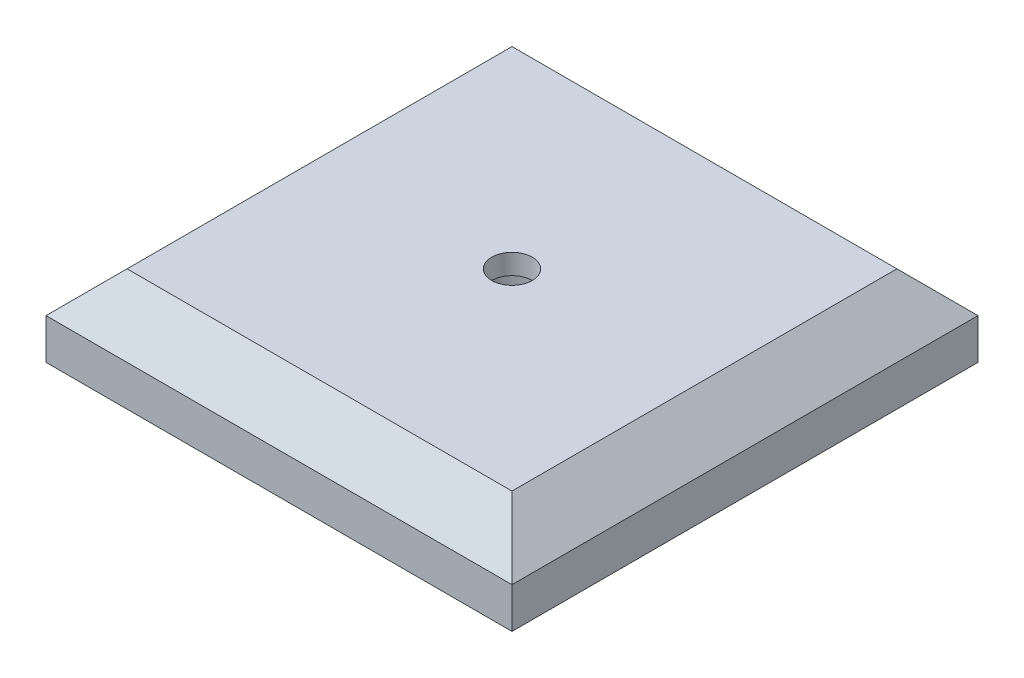
ISO-10303-21;
HEADER;
FILE_DESCRIPTION(('STEP AP214'),'2;1');
FILE_NAME('part.step','',(''),(''),'','','');
FILE_SCHEMA(('AUTOMOTIVE_DESIGN { 1 0 10303 214 1 1 1 1 }'));
ENDSEC;
DATA;
#1=APPLICATION_CONTEXT('core data for automotive mechanical design processes');
#2=APPLICATION_PROTOCOL_DEFINITION('international standard','automotive_design',2000,#1);
#3=PRODUCT_CONTEXT('',#1,'mechanical');
#4=PRODUCT('Part','Part','',(#3));
#5=PRODUCT_RELATED_PRODUCT_CATEGORY('part','',(#4));
#6=PRODUCT_DEFINITION_FORMATION('','',#4);
#7=PRODUCT_DEFINITION_CONTEXT('part definition',#1,'design');
#8=PRODUCT_DEFINITION('design','',#6,#7);
#9=PRODUCT_DEFINITION_SHAPE('','',#8);
#10=(LENGTH_UNIT() NAMED_UNIT(*) SI_UNIT(.MILLI.,.METRE.));
#11=(NAMED_UNIT(*) PLANE_ANGLE_UNIT() SI_UNIT($,.RADIAN.));
#12=(NAMED_UNIT(*) SI_UNIT($,.STERADIAN.) SOLID_ANGLE_UNIT());
#13=UNCERTAINTY_MEASURE_WITH_UNIT(LENGTH_MEASURE(1.E-05),#10,'distance_accuracy_value','');
#14=(GEOMETRIC_REPRESENTATION_CONTEXT(3) GLOBAL_UNCERTAINTY_ASSIGNED_CONTEXT((#13)) GLOBAL_UNIT_ASSIGNED_CONTEXT((#10,
#11,#12)) REPRESENTATION_CONTEXT('',''));
#15=CARTESIAN_POINT('',(0.,0.,0.));
#16=DIRECTION('',(0.,0.,1.));
#17=DIRECTION('',(1.,0.,0.));
#18=AXIS2_PLACEMENT_3D('',#15,#16,#17);
#19=CARTESIAN_POINT('',(1.4375,0.5,1.4375));
#20=DIRECTION('',(-1.,0.,0.));
#21=DIRECTION('',(0.,0.,1.));
#22=AXIS2_PLACEMENT_3D('',#19,#20,#21);
#23=PLANE('',#22);
#24=DIRECTION('',(0.,-1.,0.));
#25=VECTOR('',#24,1.);
#26=CARTESIAN_POINT('',(1.4375,0.5,-1.4375));
#27=LINE('',#26,#25);
#28=CARTESIAN_POINT('',(1.4375,0.25,-1.4375));
#29=VERTEX_POINT('',#28);
#30=CARTESIAN_POINT('',(1.4375,0.,-1.4375));
#31=VERTEX_POINT('',#30);
#32=EDGE_CURVE('E94',#29,#31,#27,.T.);
#33=ORIENTED_EDGE('',*,*,#32,.F.);
#34=DIRECTION('',(0.,0.,1.));
#35=VECTOR('',#34,1.);
#36=CARTESIAN_POINT('',(1.4375,0.25,1.4375));
#37=LINE('',#36,#35);
#38=CARTESIAN_POINT('',(1.4375,0.25,1.4375));
#39=VERTEX_POINT('',#38);
#40=EDGE_CURVE('E52',#29,#39,#37,.T.);
#41=ORIENTED_EDGE('',*,*,#40,.T.);
#42=DIRECTION('',(0.,-1.,0.));
#43=VECTOR('',#42,1.);
#44=CARTESIAN_POINT('',(1.4375,0.5,1.4375));
#45=LINE('',#44,#43);
#46=CARTESIAN_POINT('',(1.4375,0.,1.4375));
#47=VERTEX_POINT('',#46);
#48=EDGE_CURVE('E113',#39,#47,#45,.T.);
#49=ORIENTED_EDGE('',*,*,#48,.T.);
#50=DIRECTION('',(0.,0.,-1.));
#51=VECTOR('',#50,1.);
#52=CARTESIAN_POINT('',(1.4375,0.,1.4375));
#53=LINE('',#52,#51);
#54=EDGE_CURVE('E108',#47,#31,#53,.T.);
#55=ORIENTED_EDGE('',*,*,#54,.T.);
#56=EDGE_LOOP('',(#33,#41,#49,#55));
#57=FACE_BOUND('',#56,.T.);
#58=ADVANCED_FACE('F41',(#57),#23,.F.);
#59=CARTESIAN_POINT('',(-1.4375,0.5,-1.4375));
#60=DIRECTION('',(0.,0.,1.));
#61=DIRECTION('',(1.,0.,0.));
#62=AXIS2_PLACEMENT_3D('',#59,#60,#61);
#63=PLANE('',#62);
#64=DIRECTION('',(0.,-1.,0.));
#65=VECTOR('',#64,1.);
#66=CARTESIAN_POINT('',(-1.4375,0.5,-1.4375));
#67=LINE('',#66,#65);
#68=CARTESIAN_POINT('',(-1.4375,0.25,-1.4375));
#69=VERTEX_POINT('',#68);
#70=CARTESIAN_POINT('',(-1.4375,0.,-1.4375));
#71=VERTEX_POINT('',#70);
#72=EDGE_CURVE('E102',#69,#71,#67,.T.);
#73=ORIENTED_EDGE('',*,*,#72,.F.);
#74=DIRECTION('',(1.,0.,0.));
#75=VECTOR('',#74,1.);
#76=CARTESIAN_POINT('',(-1.4375,0.25,-1.4375));
#77=LINE('',#76,#75);
#78=EDGE_CURVE('E11',#69,#29,#77,.T.);
#79=ORIENTED_EDGE('',*,*,#78,.T.);
#80=ORIENTED_EDGE('',*,*,#32,.T.);
#81=DIRECTION('',(-1.,0.,0.));
#82=VECTOR('',#81,1.);
#83=CARTESIAN_POINT('',(-1.4375,0.,-1.4375));
#84=LINE('',#83,#82);
#85=EDGE_CURVE('E97',#31,#71,#84,.T.);
#86=ORIENTED_EDGE('',*,*,#85,.T.);
#87=EDGE_LOOP('',(#73,#79,#80,#86));
#88=FACE_BOUND('',#87,.T.);
#89=ADVANCED_FACE('F96',(#88),#63,.F.);
#90=CARTESIAN_POINT('',(-1.4375,0.5,1.4375));
#91=DIRECTION('',(1.,0.,0.));
#92=DIRECTION('',(0.,0.,-1.));
#93=AXIS2_PLACEMENT_3D('',#90,#91,#92);
#94=PLANE('',#93);
#95=DIRECTION('',(0.,-1.,0.));
#96=VECTOR('',#95,1.);
#97=CARTESIAN_POINT('',(-1.4375,0.5,1.4375));
#98=LINE('',#97,#96);
#99=CARTESIAN_POINT('',(-1.4375,0.25,1.4375));
#100=VERTEX_POINT('',#99);
#101=CARTESIAN_POINT('',(-1.4375,0.,1.4375));
#102=VERTEX_POINT('',#101);
#103=EDGE_CURVE('E131',#100,#102,#98,.T.);
#104=ORIENTED_EDGE('',*,*,#103,.F.);
#105=DIRECTION('',(0.,0.,-1.));
#106=VECTOR('',#105,1.);
#107=CARTESIAN_POINT('',(-1.4375,0.25,1.4375));
#108=LINE('',#107,#106);
#109=EDGE_CURVE('E148',#100,#69,#108,.T.);
#110=ORIENTED_EDGE('',*,*,#109,.T.);
#111=ORIENTED_EDGE('',*,*,#72,.T.);
#112=DIRECTION('',(0.,0.,1.));
#113=VECTOR('',#112,1.);
#114=CARTESIAN_POINT('',(-1.4375,0.,1.4375));
#115=LINE('',#114,#113);
#116=EDGE_CURVE('E110',#71,#102,#115,.T.);
#117=ORIENTED_EDGE('',*,*,#116,.T.);
#118=EDGE_LOOP('',(#104,#110,#111,#117));
#119=FACE_BOUND('',#118,.T.);
#120=ADVANCED_FACE('F207',(#119),#94,.F.);
#121=CARTESIAN_POINT('',(-1.4375,0.5,1.4375));
#122=DIRECTION('',(0.,0.,-1.));
#123=DIRECTION('',(-1.,0.,0.));
#124=AXIS2_PLACEMENT_3D('',#121,#122,#123);
#125=PLANE('',#124);
#126=ORIENTED_EDGE('',*,*,#48,.F.);
#127=DIRECTION('',(-1.,0.,0.));
#128=VECTOR('',#127,1.);
#129=CARTESIAN_POINT('',(-1.4375,0.25,1.4375));
#130=LINE('',#129,#128);
#131=EDGE_CURVE('E152',#39,#100,#130,.T.);
#132=ORIENTED_EDGE('',*,*,#131,.T.);
#133=ORIENTED_EDGE('',*,*,#103,.T.);
#134=DIRECTION('',(1.,0.,0.));
#135=VECTOR('',#134,1.);
#136=CARTESIAN_POINT('',(-1.4375,0.,1.4375));
#137=LINE('',#136,#135);
#138=EDGE_CURVE('E126',#102,#47,#137,.T.);
#139=ORIENTED_EDGE('',*,*,#138,.T.);
#140=EDGE_LOOP('',(#126,#132,#133,#139));
#141=FACE_BOUND('',#140,.T.);
#142=ADVANCED_FACE('F198',(#141),#125,.F.);
#143=CARTESIAN_POINT('',(0.,0.5,0.));
#144=DIRECTION('',(0.,-1.,0.));
#145=DIRECTION('',(0.,0.,-1.));
#146=AXIS2_PLACEMENT_3D('',#143,#144,#145);
#147=PLANE('',#146);
#148=DIRECTION('',(-1.,0.,0.));
#149=VECTOR('',#148,1.);
#150=CARTESIAN_POINT('',(0.,0.5,-1.1875));
#151=LINE('',#150,#149);
#152=CARTESIAN_POINT('',(1.1875,0.5,-1.1875));
#153=VERTEX_POINT('',#152);
#154=CARTESIAN_POINT('',(-1.1875,0.5,-1.1875));
#155=VERTEX_POINT('',#154);
#156=EDGE_CURVE('E101',#153,#155,#151,.T.);
#157=ORIENTED_EDGE('',*,*,#156,.T.);
#158=DIRECTION('',(0.,0.,1.));
#159=VECTOR('',#158,1.);
#160=CARTESIAN_POINT('',(-1.1875,0.5,0.));
#161=LINE('',#160,#159);
#162=CARTESIAN_POINT('',(-1.1875,0.5,1.1875));
#163=VERTEX_POINT('',#162);
#164=EDGE_CURVE('E144',#155,#163,#161,.T.);
#165=ORIENTED_EDGE('',*,*,#164,.T.);
#166=DIRECTION('',(1.,0.,0.));
#167=VECTOR('',#166,1.);
#168=CARTESIAN_POINT('',(0.,0.5,1.1875));
#169=LINE('',#168,#167);
#170=CARTESIAN_POINT('',(1.1875,0.5,1.1875));
#171=VERTEX_POINT('',#170);
#172=EDGE_CURVE('E141',#163,#171,#169,.T.);
#173=ORIENTED_EDGE('',*,*,#172,.T.);
#174=DIRECTION('',(0.,0.,-1.));
#175=VECTOR('',#174,1.);
#176=CARTESIAN_POINT('',(1.1875,0.5,0.));
#177=LINE('',#176,#175);
#178=EDGE_CURVE('E138',#171,#153,#177,.T.);
#179=ORIENTED_EDGE('',*,*,#178,.T.);
#180=EDGE_LOOP('',(#157,#165,#173,#179));
#181=FACE_BOUND('',#180,.T.);
#182=CARTESIAN_POINT('',(0.,0.5,0.));
#183=DIRECTION('',(0.,1.,0.));
#184=DIRECTION('',(0.,0.,1.));
#185=AXIS2_PLACEMENT_3D('',#182,#183,#184);
#186=CIRCLE('',#185,0.125);
#187=CARTESIAN_POINT('',(0.,0.5,0.125));
#188=VERTEX_POINT('',#187);
#189=EDGE_CURVE('E116',#188,#188,#186,.T.);
#190=ORIENTED_EDGE('',*,*,#189,.F.);
#191=EDGE_LOOP('',(#190));
#192=FACE_BOUND('',#191,.T.);
#193=ADVANCED_FACE('F196',(#181,#192),#147,.F.);
#194=CARTESIAN_POINT('',(0.,0.,0.));
#195=DIRECTION('',(0.,-1.,0.));
#196=DIRECTION('',(0.,0.,-1.));
#197=AXIS2_PLACEMENT_3D('',#194,#195,#196);
#198=PLANE('',#197);
#199=CARTESIAN_POINT('',(0.,0.,0.));
#200=DIRECTION('',(0.,-1.,0.));
#201=DIRECTION('',(0.,0.,-1.));
#202=AXIS2_PLACEMENT_3D('',#199,#200,#201);
#203=CIRCLE('',#202,0.25);
#204=CARTESIAN_POINT('',(0.,0.,-0.25));
#205=VERTEX_POINT('',#204);
#206=EDGE_CURVE('E171',#205,#205,#203,.T.);
#207=ORIENTED_EDGE('',*,*,#206,.F.);
#208=EDGE_LOOP('',(#207));
#209=FACE_BOUND('',#208,.T.);
#210=ORIENTED_EDGE('',*,*,#54,.F.);
#211=ORIENTED_EDGE('',*,*,#138,.F.);
#212=ORIENTED_EDGE('',*,*,#116,.F.);
#213=ORIENTED_EDGE('',*,*,#85,.F.);
#214=EDGE_LOOP('',(#210,#211,#212,#213));
#215=FACE_BOUND('',#214,.T.);
#216=ADVANCED_FACE('F106',(#209,#215),#198,.T.);
#217=CARTESIAN_POINT('',(0.,0.375,0.));
#218=DIRECTION('',(0.,1.,0.));
#219=DIRECTION('',(0.,0.,1.));
#220=AXIS2_PLACEMENT_3D('',#217,#218,#219);
#221=CYLINDRICAL_SURFACE('',#220,0.125);
#222=CARTESIAN_POINT('',(0.,0.375,0.));
#223=DIRECTION('',(0.,1.,0.));
#224=DIRECTION('',(0.,0.,1.));
#225=AXIS2_PLACEMENT_3D('',#222,#223,#224);
#226=CIRCLE('',#225,0.125);
#227=CARTESIAN_POINT('',(0.,0.375,0.125));
#228=VERTEX_POINT('',#227);
#229=EDGE_CURVE('E120',#228,#228,#226,.T.);
#230=ORIENTED_EDGE('',*,*,#229,.F.);
#231=EDGE_LOOP('',(#230));
#232=FACE_BOUND('',#231,.T.);
#233=ORIENTED_EDGE('',*,*,#189,.T.);
#234=EDGE_LOOP('',(#233));
#235=FACE_BOUND('',#234,.T.);
#236=ADVANCED_FACE('F190',(#232,#235),#221,.F.);
#237=CARTESIAN_POINT('',(0.,0.375,0.));
#238=DIRECTION('',(0.,-1.,0.));
#239=DIRECTION('',(0.,0.,-1.));
#240=AXIS2_PLACEMENT_3D('',#237,#238,#239);
#241=PLANE('',#240);
#242=CARTESIAN_POINT('',(0.,0.375,0.));
#243=DIRECTION('',(0.,-1.,0.));
#244=DIRECTION('',(0.,0.,-1.));
#245=AXIS2_PLACEMENT_3D('',#242,#243,#244);
#246=CIRCLE('',#245,0.25);
#247=CARTESIAN_POINT('',(0.,0.375,-0.25));
#248=VERTEX_POINT('',#247);
#249=EDGE_CURVE('E177',#248,#248,#246,.T.);
#250=ORIENTED_EDGE('',*,*,#249,.T.);
#251=EDGE_LOOP('',(#250));
#252=FACE_BOUND('',#251,.T.);
#253=ORIENTED_EDGE('',*,*,#229,.T.);
#254=EDGE_LOOP('',(#253));
#255=FACE_BOUND('',#254,.T.);
#256=ADVANCED_FACE('F188',(#252,#255),#241,.T.);
#257=CARTESIAN_POINT('',(0.,0.375,0.));
#258=DIRECTION('',(0.,-1.,0.));
#259=DIRECTION('',(0.,0.,-1.));
#260=AXIS2_PLACEMENT_3D('',#257,#258,#259);
#261=CYLINDRICAL_SURFACE('',#260,0.25);
#262=ORIENTED_EDGE('',*,*,#249,.F.);
#263=EDGE_LOOP('',(#262));
#264=FACE_BOUND('',#263,.T.);
#265=ORIENTED_EDGE('',*,*,#206,.T.);
#266=EDGE_LOOP('',(#265));
#267=FACE_BOUND('',#266,.T.);
#268=ADVANCED_FACE('F238',(#264,#267),#261,.F.);
#269=CARTESIAN_POINT('',(1.1875,0.5,0.));
#270=DIRECTION('',(-0.707106781186547,-0.707106781186547,0.));
#271=DIRECTION('',(0.,0.,-1.));
#272=AXIS2_PLACEMENT_3D('',#269,#270,#271);
#273=PLANE('',#272);
#274=DIRECTION('',(0.577350269189626,-0.577350269189626,0.577350269189626));
#275=VECTOR('',#274,1.);
#276=CARTESIAN_POINT('',(0.791666666666666,0.895833333333333,0.791666666666667));
#277=LINE('',#276,#275);
#278=EDGE_CURVE('E162',#39,#171,#277,.F.);
#279=ORIENTED_EDGE('',*,*,#278,.F.);
#280=ORIENTED_EDGE('',*,*,#40,.F.);
#281=DIRECTION('',(0.577350269189626,-0.577350269189626,-0.577350269189626));
#282=VECTOR('',#281,1.);
#283=CARTESIAN_POINT('',(0.791666666666667,0.895833333333333,-0.791666666666666));
#284=LINE('',#283,#282);
#285=EDGE_CURVE('E46',#153,#29,#284,.T.);
#286=ORIENTED_EDGE('',*,*,#285,.F.);
#287=ORIENTED_EDGE('',*,*,#178,.F.);
#288=EDGE_LOOP('',(#279,#280,#286,#287));
#289=FACE_BOUND('',#288,.T.);
#290=ADVANCED_FACE('F44',(#289),#273,.F.);
#291=CARTESIAN_POINT('',(0.,0.5,-1.1875));
#292=DIRECTION('',(0.,-0.707106781186547,0.707106781186547));
#293=DIRECTION('',(-1.,0.,0.));
#294=AXIS2_PLACEMENT_3D('',#291,#292,#293);
#295=PLANE('',#294);
#296=ORIENTED_EDGE('',*,*,#285,.T.);
#297=ORIENTED_EDGE('',*,*,#78,.F.);
#298=DIRECTION('',(0.577350269189626,0.577350269189626,0.577350269189626));
#299=VECTOR('',#298,1.);
#300=CARTESIAN_POINT('',(-0.791666666666667,0.895833333333333,-0.791666666666666));
#301=LINE('',#300,#299);
#302=EDGE_CURVE('E160',#155,#69,#301,.F.);
#303=ORIENTED_EDGE('',*,*,#302,.F.);
#304=ORIENTED_EDGE('',*,*,#156,.F.);
#305=EDGE_LOOP('',(#296,#297,#303,#304));
#306=FACE_BOUND('',#305,.T.);
#307=ADVANCED_FACE('F231',(#306),#295,.F.);
#308=CARTESIAN_POINT('',(0.,0.5,1.1875));
#309=DIRECTION('',(0.,-0.707106781186547,-0.707106781186547));
#310=DIRECTION('',(1.,0.,0.));
#311=AXIS2_PLACEMENT_3D('',#308,#309,#310);
#312=PLANE('',#311);
#313=ORIENTED_EDGE('',*,*,#278,.T.);
#314=ORIENTED_EDGE('',*,*,#172,.F.);
#315=DIRECTION('',(-0.577350269189626,-0.577350269189626,0.577350269189626));
#316=VECTOR('',#315,1.);
#317=CARTESIAN_POINT('',(-0.791666666666667,0.895833333333333,0.791666666666666));
#318=LINE('',#317,#316);
#319=EDGE_CURVE('E157',#100,#163,#318,.F.);
#320=ORIENTED_EDGE('',*,*,#319,.F.);
#321=ORIENTED_EDGE('',*,*,#131,.F.);
#322=EDGE_LOOP('',(#313,#314,#320,#321));
#323=FACE_BOUND('',#322,.T.);
#324=ADVANCED_FACE('F225',(#323),#312,.F.);
#325=CARTESIAN_POINT('',(-1.1875,0.5,0.));
#326=DIRECTION('',(0.707106781186547,-0.707106781186547,0.));
#327=DIRECTION('',(0.,0.,1.));
#328=AXIS2_PLACEMENT_3D('',#325,#326,#327);
#329=PLANE('',#328);
#330=ORIENTED_EDGE('',*,*,#302,.T.);
#331=ORIENTED_EDGE('',*,*,#109,.F.);
#332=ORIENTED_EDGE('',*,*,#319,.T.);
#333=ORIENTED_EDGE('',*,*,#164,.F.);
#334=EDGE_LOOP('',(#330,#331,#332,#333));
#335=FACE_BOUND('',#334,.T.);
#336=ADVANCED_FACE('F219',(#335),#329,.F.);
#337=CLOSED_SHELL('',(#58,#89,#120,#142,#193,#216,#236,#256,#268,#290,#307,#324,#336));
#338=MANIFOLD_SOLID_BREP('B2',#337);
#339=ADVANCED_BREP_SHAPE_REPRESENTATION('',(#18,#338),#14);
#340=SHAPE_DEFINITION_REPRESENTATION(#9,#339);
ENDSEC;
END-ISO-10303-21;
